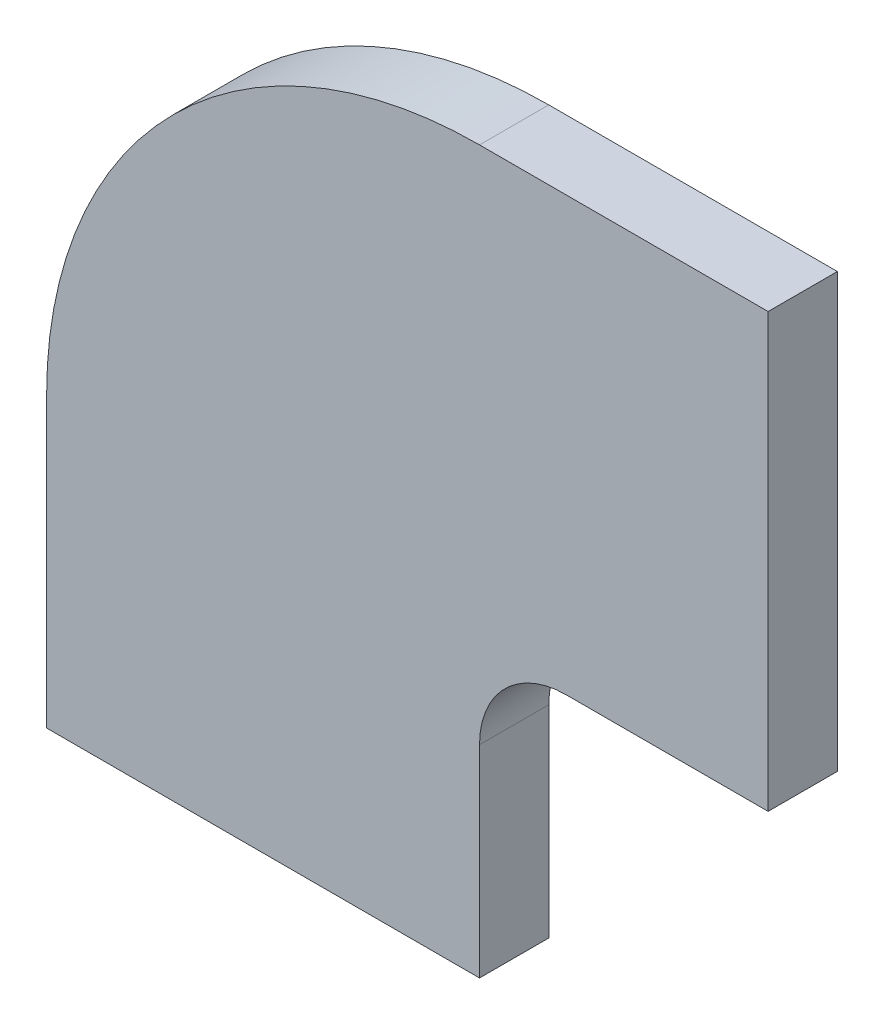
ISO-10303-21;
HEADER;
FILE_DESCRIPTION(('STEP AP214'),'2;1');
FILE_NAME('part.step','',(''),(''),'','','');
FILE_SCHEMA(('AUTOMOTIVE_DESIGN { 1 0 10303 214 1 1 1 1 }'));
ENDSEC;
DATA;
#1=APPLICATION_CONTEXT('core data for automotive mechanical design processes');
#2=APPLICATION_PROTOCOL_DEFINITION('international standard','automotive_design',2000,#1);
#3=PRODUCT_CONTEXT('',#1,'mechanical');
#4=PRODUCT('Part','Part','',(#3));
#5=PRODUCT_RELATED_PRODUCT_CATEGORY('part','',(#4));
#6=PRODUCT_DEFINITION_FORMATION('','',#4);
#7=PRODUCT_DEFINITION_CONTEXT('part definition',#1,'design');
#8=PRODUCT_DEFINITION('design','',#6,#7);
#9=PRODUCT_DEFINITION_SHAPE('','',#8);
#10=(LENGTH_UNIT() NAMED_UNIT(*) SI_UNIT(.MILLI.,.METRE.));
#11=(NAMED_UNIT(*) PLANE_ANGLE_UNIT() SI_UNIT($,.RADIAN.));
#12=(NAMED_UNIT(*) SI_UNIT($,.STERADIAN.) SOLID_ANGLE_UNIT());
#13=UNCERTAINTY_MEASURE_WITH_UNIT(LENGTH_MEASURE(1.E-05),#10,'distance_accuracy_value','');
#14=(GEOMETRIC_REPRESENTATION_CONTEXT(3) GLOBAL_UNCERTAINTY_ASSIGNED_CONTEXT((#13)) GLOBAL_UNIT_ASSIGNED_CONTEXT((#10,
#11,#12)) REPRESENTATION_CONTEXT('',''));
#15=CARTESIAN_POINT('',(0.,0.,0.));
#16=DIRECTION('',(0.,0.,1.));
#17=DIRECTION('',(1.,0.,0.));
#18=AXIS2_PLACEMENT_3D('',#15,#16,#17);
#19=CARTESIAN_POINT('',(-1.,0.,0.12));
#20=DIRECTION('',(0.,1.,0.));
#21=DIRECTION('',(0.,0.,1.));
#22=AXIS2_PLACEMENT_3D('',#19,#20,#21);
#23=PLANE('',#22);
#24=DIRECTION('',(1.,0.,0.));
#25=VECTOR('',#24,1.);
#26=CARTESIAN_POINT('',(-1.,0.,0.12));
#27=LINE('',#26,#25);
#28=CARTESIAN_POINT('',(-0.7,0.,0.12));
#29=VERTEX_POINT('',#28);
#30=CARTESIAN_POINT('',(0.,0.,0.12));
#31=VERTEX_POINT('',#30);
#32=EDGE_CURVE('E126',#29,#31,#27,.T.);
#33=ORIENTED_EDGE('',*,*,#32,.F.);
#34=DIRECTION('',(0.,0.,-1.));
#35=VECTOR('',#34,1.);
#36=CARTESIAN_POINT('',(-0.7,0.,-0.12));
#37=LINE('',#36,#35);
#38=CARTESIAN_POINT('',(-0.7,0.,-0.12));
#39=VERTEX_POINT('',#38);
#40=EDGE_CURVE('E174',#29,#39,#37,.T.);
#41=ORIENTED_EDGE('',*,*,#40,.T.);
#42=DIRECTION('',(1.,0.,0.));
#43=VECTOR('',#42,1.);
#44=CARTESIAN_POINT('',(-1.,0.,-0.12));
#45=LINE('',#44,#43);
#46=CARTESIAN_POINT('',(0.,0.,-0.12));
#47=VERTEX_POINT('',#46);
#48=EDGE_CURVE('E150',#39,#47,#45,.T.);
#49=ORIENTED_EDGE('',*,*,#48,.T.);
#50=DIRECTION('',(0.,0.,-1.));
#51=VECTOR('',#50,1.);
#52=CARTESIAN_POINT('',(0.,0.,0.12));
#53=LINE('',#52,#51);
#54=EDGE_CURVE('E143',#31,#47,#53,.T.);
#55=ORIENTED_EDGE('',*,*,#54,.F.);
#56=EDGE_LOOP('',(#33,#41,#49,#55));
#57=FACE_BOUND('',#56,.T.);
#58=ADVANCED_FACE('F45',(#57),#23,.F.);
#59=CARTESIAN_POINT('',(0.,0.,0.12));
#60=DIRECTION('',(-1.,0.,0.));
#61=DIRECTION('',(0.,0.,1.));
#62=AXIS2_PLACEMENT_3D('',#59,#60,#61);
#63=PLANE('',#62);
#64=DIRECTION('',(0.,1.,0.));
#65=VECTOR('',#64,1.);
#66=CARTESIAN_POINT('',(0.,0.,-0.12));
#67=LINE('',#66,#65);
#68=CARTESIAN_POINT('',(0.,1.5,-0.12));
#69=VERTEX_POINT('',#68);
#70=EDGE_CURVE('E181',#47,#69,#67,.T.);
#71=ORIENTED_EDGE('',*,*,#70,.T.);
#72=DIRECTION('',(0.,0.,-1.));
#73=VECTOR('',#72,1.);
#74=CARTESIAN_POINT('',(0.,1.5,0.12));
#75=LINE('',#74,#73);
#76=CARTESIAN_POINT('',(0.,1.5,0.12));
#77=VERTEX_POINT('',#76);
#78=EDGE_CURVE('E145',#77,#69,#75,.T.);
#79=ORIENTED_EDGE('',*,*,#78,.F.);
#80=DIRECTION('',(0.,1.,0.));
#81=VECTOR('',#80,1.);
#82=CARTESIAN_POINT('',(0.,0.,0.12));
#83=LINE('',#82,#81);
#84=EDGE_CURVE('E130',#31,#77,#83,.T.);
#85=ORIENTED_EDGE('',*,*,#84,.F.);
#86=ORIENTED_EDGE('',*,*,#54,.T.);
#87=EDGE_LOOP('',(#71,#79,#85,#86));
#88=FACE_BOUND('',#87,.T.);
#89=ADVANCED_FACE('F142',(#88),#63,.F.);
#90=CARTESIAN_POINT('',(0.,1.5,0.12));
#91=DIRECTION('',(0.,-1.,0.));
#92=DIRECTION('',(1.,0.,0.));
#93=AXIS2_PLACEMENT_3D('',#90,#91,#92);
#94=PLANE('',#93);
#95=DIRECTION('',(-1.,0.,0.));
#96=VECTOR('',#95,1.);
#97=CARTESIAN_POINT('',(0.,1.5,-0.12));
#98=LINE('',#97,#96);
#99=CARTESIAN_POINT('',(-1.,1.5,-0.12));
#100=VERTEX_POINT('',#99);
#101=EDGE_CURVE('E189',#69,#100,#98,.T.);
#102=ORIENTED_EDGE('',*,*,#101,.T.);
#103=DIRECTION('',(0.,0.,-1.));
#104=VECTOR('',#103,1.);
#105=CARTESIAN_POINT('',(-1.,1.5,0.12));
#106=LINE('',#105,#104);
#107=CARTESIAN_POINT('',(-1.,1.5,0.12));
#108=VERTEX_POINT('',#107);
#109=EDGE_CURVE('E168',#100,#108,#106,.F.);
#110=ORIENTED_EDGE('',*,*,#109,.T.);
#111=DIRECTION('',(-1.,0.,0.));
#112=VECTOR('',#111,1.);
#113=CARTESIAN_POINT('',(0.,1.5,0.12));
#114=LINE('',#113,#112);
#115=EDGE_CURVE('E148',#77,#108,#114,.T.);
#116=ORIENTED_EDGE('',*,*,#115,.F.);
#117=ORIENTED_EDGE('',*,*,#78,.T.);
#118=EDGE_LOOP('',(#102,#110,#116,#117));
#119=FACE_BOUND('',#118,.T.);
#120=ADVANCED_FACE('F219',(#119),#94,.F.);
#121=CARTESIAN_POINT('',(-2.5,1.5,0.12));
#122=DIRECTION('',(1.,0.,0.));
#123=DIRECTION('',(0.,0.,-1.));
#124=AXIS2_PLACEMENT_3D('',#121,#122,#123);
#125=PLANE('',#124);
#126=DIRECTION('',(0.,-1.,0.));
#127=VECTOR('',#126,1.);
#128=CARTESIAN_POINT('',(-2.5,1.5,0.12));
#129=LINE('',#128,#127);
#130=CARTESIAN_POINT('',(-2.5,0.,0.12));
#131=VERTEX_POINT('',#130);
#132=CARTESIAN_POINT('',(-2.5,-1.,0.12));
#133=VERTEX_POINT('',#132);
#134=EDGE_CURVE('E224',#131,#133,#129,.T.);
#135=ORIENTED_EDGE('',*,*,#134,.F.);
#136=DIRECTION('',(0.,0.,-1.));
#137=VECTOR('',#136,1.);
#138=CARTESIAN_POINT('',(-2.5,0.,0.12));
#139=LINE('',#138,#137);
#140=CARTESIAN_POINT('',(-2.5,0.,-0.12));
#141=VERTEX_POINT('',#140);
#142=EDGE_CURVE('E153',#131,#141,#139,.T.);
#143=ORIENTED_EDGE('',*,*,#142,.T.);
#144=DIRECTION('',(0.,-1.,0.));
#145=VECTOR('',#144,1.);
#146=CARTESIAN_POINT('',(-2.5,1.5,-0.12));
#147=LINE('',#146,#145);
#148=CARTESIAN_POINT('',(-2.5,-1.,-0.12));
#149=VERTEX_POINT('',#148);
#150=EDGE_CURVE('E187',#141,#149,#147,.T.);
#151=ORIENTED_EDGE('',*,*,#150,.T.);
#152=DIRECTION('',(0.,0.,-1.));
#153=VECTOR('',#152,1.);
#154=CARTESIAN_POINT('',(-2.5,-1.,0.12));
#155=LINE('',#154,#153);
#156=EDGE_CURVE('E162',#133,#149,#155,.T.);
#157=ORIENTED_EDGE('',*,*,#156,.F.);
#158=EDGE_LOOP('',(#135,#143,#151,#157));
#159=FACE_BOUND('',#158,.T.);
#160=ADVANCED_FACE('F225',(#159),#125,.F.);
#161=CARTESIAN_POINT('',(-2.5,-1.,0.12));
#162=DIRECTION('',(0.,1.,0.));
#163=DIRECTION('',(0.,0.,1.));
#164=AXIS2_PLACEMENT_3D('',#161,#162,#163);
#165=PLANE('',#164);
#166=DIRECTION('',(1.,0.,0.));
#167=VECTOR('',#166,1.);
#168=CARTESIAN_POINT('',(-2.5,-1.,-0.12));
#169=LINE('',#168,#167);
#170=CARTESIAN_POINT('',(-1.,-1.,-0.12));
#171=VERTEX_POINT('',#170);
#172=EDGE_CURVE('E185',#149,#171,#169,.T.);
#173=ORIENTED_EDGE('',*,*,#172,.T.);
#174=DIRECTION('',(0.,0.,-1.));
#175=VECTOR('',#174,1.);
#176=CARTESIAN_POINT('',(-1.,-1.,0.12));
#177=LINE('',#176,#175);
#178=CARTESIAN_POINT('',(-1.,-1.,0.12));
#179=VERTEX_POINT('',#178);
#180=EDGE_CURVE('E198',#179,#171,#177,.T.);
#181=ORIENTED_EDGE('',*,*,#180,.F.);
#182=DIRECTION('',(1.,0.,0.));
#183=VECTOR('',#182,1.);
#184=CARTESIAN_POINT('',(-2.5,-1.,0.12));
#185=LINE('',#184,#183);
#186=EDGE_CURVE('E209',#133,#179,#185,.T.);
#187=ORIENTED_EDGE('',*,*,#186,.F.);
#188=ORIENTED_EDGE('',*,*,#156,.T.);
#189=EDGE_LOOP('',(#173,#181,#187,#188));
#190=FACE_BOUND('',#189,.T.);
#191=ADVANCED_FACE('F207',(#190),#165,.F.);
#192=CARTESIAN_POINT('',(-1.,-1.,0.12));
#193=DIRECTION('',(-1.,0.,0.));
#194=DIRECTION('',(0.,0.,1.));
#195=AXIS2_PLACEMENT_3D('',#192,#193,#194);
#196=PLANE('',#195);
#197=DIRECTION('',(0.,1.,0.));
#198=VECTOR('',#197,1.);
#199=CARTESIAN_POINT('',(-1.,-1.,-0.12));
#200=LINE('',#199,#198);
#201=CARTESIAN_POINT('',(-1.,-0.3,-0.12));
#202=VERTEX_POINT('',#201);
#203=EDGE_CURVE('E138',#171,#202,#200,.T.);
#204=ORIENTED_EDGE('',*,*,#203,.T.);
#205=DIRECTION('',(0.,0.,-1.));
#206=VECTOR('',#205,1.);
#207=CARTESIAN_POINT('',(-1.,-0.3,0.12));
#208=LINE('',#207,#206);
#209=CARTESIAN_POINT('',(-1.,-0.3,0.12));
#210=VERTEX_POINT('',#209);
#211=EDGE_CURVE('E64',#202,#210,#208,.F.);
#212=ORIENTED_EDGE('',*,*,#211,.T.);
#213=DIRECTION('',(0.,1.,0.));
#214=VECTOR('',#213,1.);
#215=CARTESIAN_POINT('',(-1.,-1.,0.12));
#216=LINE('',#215,#214);
#217=EDGE_CURVE('E200',#179,#210,#216,.T.);
#218=ORIENTED_EDGE('',*,*,#217,.F.);
#219=ORIENTED_EDGE('',*,*,#180,.T.);
#220=EDGE_LOOP('',(#204,#212,#218,#219));
#221=FACE_BOUND('',#220,.T.);
#222=ADVANCED_FACE('F214',(#221),#196,.F.);
#223=CARTESIAN_POINT('',(0.,0.,0.12));
#224=DIRECTION('',(0.,0.,1.));
#225=DIRECTION('',(1.,0.,0.));
#226=AXIS2_PLACEMENT_3D('',#223,#224,#225);
#227=PLANE('',#226);
#228=ORIENTED_EDGE('',*,*,#115,.T.);
#229=CARTESIAN_POINT('',(-1.,0.,0.12));
#230=DIRECTION('',(0.,0.,1.));
#231=DIRECTION('',(1.,0.,0.));
#232=AXIS2_PLACEMENT_3D('',#229,#230,#231);
#233=CIRCLE('',#232,1.5);
#234=EDGE_CURVE('E171',#108,#131,#233,.T.);
#235=ORIENTED_EDGE('',*,*,#234,.T.);
#236=ORIENTED_EDGE('',*,*,#134,.T.);
#237=ORIENTED_EDGE('',*,*,#186,.T.);
#238=ORIENTED_EDGE('',*,*,#217,.T.);
#239=CARTESIAN_POINT('',(-0.7,-0.3,0.12));
#240=DIRECTION('',(0.,0.,1.));
#241=DIRECTION('',(1.,0.,0.));
#242=AXIS2_PLACEMENT_3D('',#239,#240,#241);
#243=CIRCLE('',#242,0.3);
#244=EDGE_CURVE('E11',#210,#29,#243,.F.);
#245=ORIENTED_EDGE('',*,*,#244,.T.);
#246=ORIENTED_EDGE('',*,*,#32,.T.);
#247=ORIENTED_EDGE('',*,*,#84,.T.);
#248=EDGE_LOOP('',(#228,#235,#236,#237,#238,#245,#246,#247));
#249=FACE_BOUND('',#248,.T.);
#250=ADVANCED_FACE('F129',(#249),#227,.T.);
#251=CARTESIAN_POINT('',(0.,0.,-0.12));
#252=DIRECTION('',(0.,0.,1.));
#253=DIRECTION('',(1.,0.,0.));
#254=AXIS2_PLACEMENT_3D('',#251,#252,#253);
#255=PLANE('',#254);
#256=ORIENTED_EDGE('',*,*,#150,.F.);
#257=CARTESIAN_POINT('',(-1.,0.,-0.12));
#258=DIRECTION('',(0.,0.,1.));
#259=DIRECTION('',(1.,0.,0.));
#260=AXIS2_PLACEMENT_3D('',#257,#258,#259);
#261=CIRCLE('',#260,1.5);
#262=EDGE_CURVE('E159',#141,#100,#261,.F.);
#263=ORIENTED_EDGE('',*,*,#262,.T.);
#264=ORIENTED_EDGE('',*,*,#101,.F.);
#265=ORIENTED_EDGE('',*,*,#70,.F.);
#266=ORIENTED_EDGE('',*,*,#48,.F.);
#267=CARTESIAN_POINT('',(-0.7,-0.3,-0.12));
#268=DIRECTION('',(0.,0.,1.));
#269=DIRECTION('',(1.,0.,0.));
#270=AXIS2_PLACEMENT_3D('',#267,#268,#269);
#271=CIRCLE('',#270,0.3);
#272=EDGE_CURVE('E54',#39,#202,#271,.T.);
#273=ORIENTED_EDGE('',*,*,#272,.T.);
#274=ORIENTED_EDGE('',*,*,#203,.F.);
#275=ORIENTED_EDGE('',*,*,#172,.F.);
#276=EDGE_LOOP('',(#256,#263,#264,#265,#266,#273,#274,#275));
#277=FACE_BOUND('',#276,.T.);
#278=ADVANCED_FACE('F213',(#277),#255,.F.);
#279=CARTESIAN_POINT('',(-1.,0.,0.12));
#280=DIRECTION('',(0.,0.,-1.));
#281=DIRECTION('',(-1.,0.,0.));
#282=AXIS2_PLACEMENT_3D('',#279,#280,#281);
#283=CYLINDRICAL_SURFACE('',#282,1.5);
#284=ORIENTED_EDGE('',*,*,#234,.F.);
#285=ORIENTED_EDGE('',*,*,#109,.F.);
#286=ORIENTED_EDGE('',*,*,#262,.F.);
#287=ORIENTED_EDGE('',*,*,#142,.F.);
#288=EDGE_LOOP('',(#284,#285,#286,#287));
#289=FACE_BOUND('',#288,.T.);
#290=ADVANCED_FACE('F222',(#289),#283,.T.);
#291=CARTESIAN_POINT('',(-0.7,-0.3,0.12));
#292=DIRECTION('',(0.,0.,1.));
#293=DIRECTION('',(1.,0.,0.));
#294=AXIS2_PLACEMENT_3D('',#291,#292,#293);
#295=CYLINDRICAL_SURFACE('',#294,0.3);
#296=ORIENTED_EDGE('',*,*,#244,.F.);
#297=ORIENTED_EDGE('',*,*,#211,.F.);
#298=ORIENTED_EDGE('',*,*,#272,.F.);
#299=ORIENTED_EDGE('',*,*,#40,.F.);
#300=EDGE_LOOP('',(#296,#297,#298,#299));
#301=FACE_BOUND('',#300,.T.);
#302=ADVANCED_FACE('F47',(#301),#295,.F.);
#303=CLOSED_SHELL('',(#58,#89,#120,#160,#191,#222,#250,#278,#290,#302));
#304=MANIFOLD_SOLID_BREP('B2',#303);
#305=ADVANCED_BREP_SHAPE_REPRESENTATION('',(#18,#304),#14);
#306=SHAPE_DEFINITION_REPRESENTATION(#9,#305);
ENDSEC;
END-ISO-10303-21;
